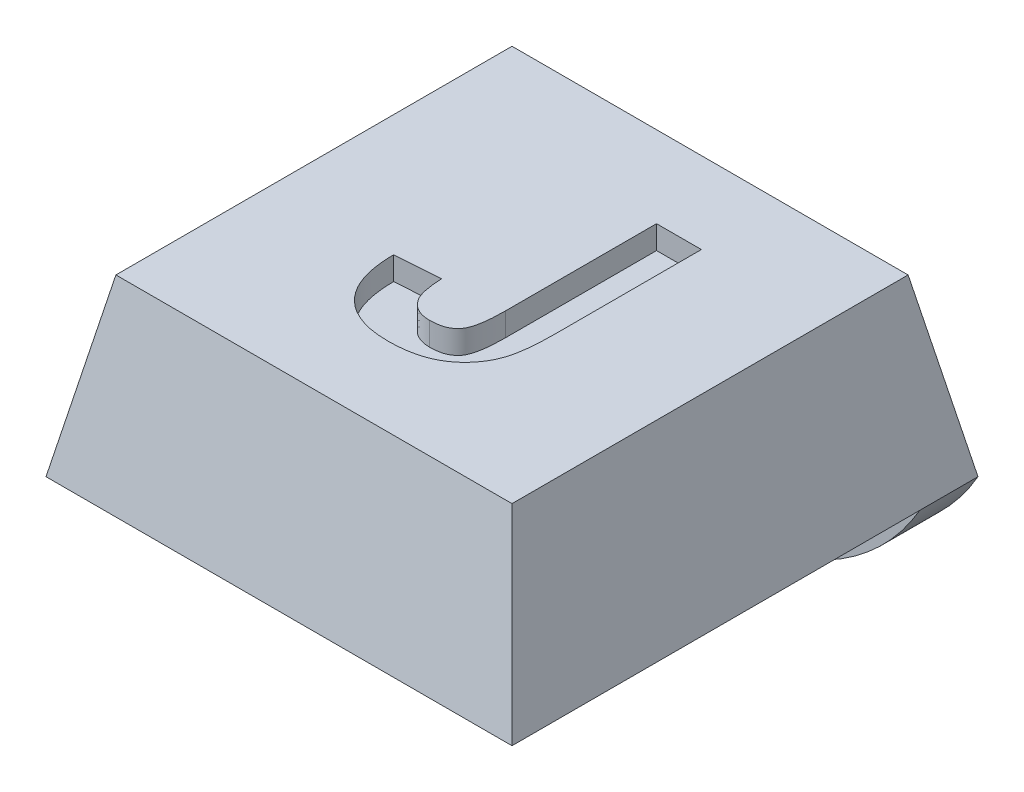
ISO-10303-21;
HEADER;
FILE_DESCRIPTION(('STEP AP214'),'2;1');
FILE_NAME('part.step','',(''),(''),'','','');
FILE_SCHEMA(('AUTOMOTIVE_DESIGN { 1 0 10303 214 1 1 1 1 }'));
ENDSEC;
DATA;
#1=APPLICATION_CONTEXT('core data for automotive mechanical design processes');
#2=APPLICATION_PROTOCOL_DEFINITION('international standard','automotive_design',2000,#1);
#3=PRODUCT_CONTEXT('',#1,'mechanical');
#4=PRODUCT('Part','Part','',(#3));
#5=PRODUCT_RELATED_PRODUCT_CATEGORY('part','',(#4));
#6=PRODUCT_DEFINITION_FORMATION('','',#4);
#7=PRODUCT_DEFINITION_CONTEXT('part definition',#1,'design');
#8=PRODUCT_DEFINITION('design','',#6,#7);
#9=PRODUCT_DEFINITION_SHAPE('','',#8);
#10=(LENGTH_UNIT() NAMED_UNIT(*) SI_UNIT(.MILLI.,.METRE.));
#11=(NAMED_UNIT(*) PLANE_ANGLE_UNIT() SI_UNIT($,.RADIAN.));
#12=(NAMED_UNIT(*) SI_UNIT($,.STERADIAN.) SOLID_ANGLE_UNIT());
#13=UNCERTAINTY_MEASURE_WITH_UNIT(LENGTH_MEASURE(1.E-05),#10,'distance_accuracy_value','');
#14=(GEOMETRIC_REPRESENTATION_CONTEXT(3) GLOBAL_UNCERTAINTY_ASSIGNED_CONTEXT((#13)) GLOBAL_UNIT_ASSIGNED_CONTEXT((#10,
#11,#12)) REPRESENTATION_CONTEXT('',''));
#15=CARTESIAN_POINT('',(0.,0.,0.));
#16=DIRECTION('',(0.,0.,1.));
#17=DIRECTION('',(1.,0.,0.));
#18=AXIS2_PLACEMENT_3D('',#15,#16,#17);
#19=CARTESIAN_POINT('',(0.,3.,0.));
#20=DIRECTION('',(0.,-1.,0.));
#21=DIRECTION('',(0.,0.,-1.));
#22=AXIS2_PLACEMENT_3D('',#19,#20,#21);
#23=PLANE('',#22);
#24=DIRECTION('',(-1.,0.,0.));
#25=VECTOR('',#24,1.);
#26=CARTESIAN_POINT('',(11.,3.,-0.6));
#27=LINE('',#26,#25);
#28=CARTESIAN_POINT('',(7.4,3.,-0.6));
#29=VERTEX_POINT('',#28);
#30=CARTESIAN_POINT('',(0.6,3.,-0.6));
#31=VERTEX_POINT('',#30);
#32=EDGE_CURVE('E217',#29,#31,#27,.T.);
#33=ORIENTED_EDGE('',*,*,#32,.F.);
#34=DIRECTION('',(0.,0.,1.));
#35=VECTOR('',#34,1.);
#36=CARTESIAN_POINT('',(7.4,3.,-8.));
#37=LINE('',#36,#35);
#38=CARTESIAN_POINT('',(7.4,3.,-7.4));
#39=VERTEX_POINT('',#38);
#40=EDGE_CURVE('E230',#39,#29,#37,.T.);
#41=ORIENTED_EDGE('',*,*,#40,.F.);
#42=DIRECTION('',(-1.,0.,0.));
#43=VECTOR('',#42,1.);
#44=CARTESIAN_POINT('',(11.,3.,-7.4));
#45=LINE('',#44,#43);
#46=CARTESIAN_POINT('',(0.599999999999999,3.,-7.4));
#47=VERTEX_POINT('',#46);
#48=EDGE_CURVE('E213',#39,#47,#45,.T.);
#49=ORIENTED_EDGE('',*,*,#48,.T.);
#50=DIRECTION('',(0.,0.,1.));
#51=VECTOR('',#50,1.);
#52=CARTESIAN_POINT('',(0.6,3.,-8.));
#53=LINE('',#52,#51);
#54=EDGE_CURVE('E233',#47,#31,#53,.T.);
#55=ORIENTED_EDGE('',*,*,#54,.T.);
#56=EDGE_LOOP('',(#33,#41,#49,#55));
#57=FACE_BOUND('',#56,.T.);
#58=DIRECTION('',(0.,0.,-1.));
#59=VECTOR('',#58,1.);
#60=CARTESIAN_POINT('',(4.47863523599211,3.,-3.41391404386237));
#61=LINE('',#60,#59);
#62=CARTESIAN_POINT('',(4.47863523599211,3.,-3.41391404386237));
#63=VERTEX_POINT('',#62);
#64=CARTESIAN_POINT('',(4.47863523599211,3.,-6.00285635155468));
#65=VERTEX_POINT('',#64);
#66=EDGE_CURVE('E58',#63,#65,#61,.T.);
#67=ORIENTED_EDGE('',*,*,#66,.T.);
#68=DIRECTION('',(1.,0.,0.));
#69=VECTOR('',#68,1.);
#70=CARTESIAN_POINT('',(4.47863523599211,3.,-6.00285635155468));
#71=LINE('',#70,#69);
#72=CARTESIAN_POINT('',(5.24786600522288,3.,-6.00285635155468));
#73=VERTEX_POINT('',#72);
#74=EDGE_CURVE('E185',#65,#73,#71,.T.);
#75=ORIENTED_EDGE('',*,*,#74,.T.);
#76=DIRECTION('',(0.,0.,1.));
#77=VECTOR('',#76,1.);
#78=CARTESIAN_POINT('',(5.24786600522288,3.,-6.00285635155468));
#79=LINE('',#78,#77);
#80=CARTESIAN_POINT('',(5.24786600522288,3.,-3.48122173617007));
#81=VERTEX_POINT('',#80);
#82=EDGE_CURVE('E656',#73,#81,#79,.T.);
#83=ORIENTED_EDGE('',*,*,#82,.T.);
#84=CARTESIAN_POINT('',(5.24786600522288,3.,-3.48122173617007));
#85=CARTESIAN_POINT('',(5.24752225511572,3.,-3.44115386886636));
#86=CARTESIAN_POINT('',(5.2468552055461,3.,-3.36340188251499));
#87=CARTESIAN_POINT('',(5.24275650156162,3.,-3.25039046502719));
#88=CARTESIAN_POINT('',(5.23665832133049,3.,-3.14454193046868));
#89=CARTESIAN_POINT('',(5.22727722213507,3.,-3.04587147100803));
#90=CARTESIAN_POINT('',(5.21405872026987,3.,-2.95459238833429));
#91=CARTESIAN_POINT('',(5.20004986677814,3.,-2.86997657489744));
#92=CARTESIAN_POINT('',(5.18304142709716,3.,-2.79245169237198));
#93=CARTESIAN_POINT('',(5.16780003561618,3.,-2.74395130585806));
#94=CARTESIAN_POINT('',(5.16052626163313,3.,-2.7208050695034));
#95=B_SPLINE_CURVE_WITH_KNOTS('',3,(#84,#85,#86,#87,#88,#89,#90,#91,#92,#93,#94),.UNSPECIFIED.,
.F.,.F.,(4,1,1,1,1,1,1,1,4),(0.,0.156452495119165,0.303597198546586,0.441515756123935,
0.57040444623701,0.690463066411908,0.801567510862614,0.905300439354285,1.),.UNSPECIFIED.);
#96=CARTESIAN_POINT('',(5.16052626163313,3.,-2.7208050695034));
#97=VERTEX_POINT('',#96);
#98=EDGE_CURVE('E651',#81,#97,#95,.T.);
#99=ORIENTED_EDGE('',*,*,#98,.T.);
#100=CARTESIAN_POINT('',(5.16052626163313,3.,-2.7208050695034));
#101=CARTESIAN_POINT('',(5.15036108111888,3.,-2.69228260075384));
#102=CARTESIAN_POINT('',(5.13024360189988,3.,-2.63583498808826));
#103=CARTESIAN_POINT('',(5.09114165266873,3.,-2.55531488098573));
#104=CARTESIAN_POINT('',(5.04617643068522,3.,-2.47908431540956));
#105=CARTESIAN_POINT('',(4.9954744836834,3.,-2.40681293841355));
#106=CARTESIAN_POINT('',(4.93951471700895,3.,-2.3382109873061));
#107=CARTESIAN_POINT('',(4.87639907650832,3.,-2.27508664932136));
#108=CARTESIAN_POINT('',(4.80834779956692,3.,-2.21523809822528));
#109=CARTESIAN_POINT('',(4.73344668122952,3.,-2.16114528886516));
#110=CARTESIAN_POINT('',(4.65358079146145,3.,-2.11070979383156));
#111=CARTESIAN_POINT('',(4.56647505050752,3.,-2.06868896260535));
#112=CARTESIAN_POINT('',(4.47384329891444,3.,-2.03234038710198));
#113=CARTESIAN_POINT('',(4.37490810397317,3.,-2.00281662788184));
#114=CARTESIAN_POINT('',(4.26964077765763,3.,-1.97971607285242));
#115=CARTESIAN_POINT('',(4.15831100110899,3.,-1.96290189406509));
#116=CARTESIAN_POINT('',(4.04077046567442,3.,-1.95334773003709));
#117=CARTESIAN_POINT('',(3.96049016407211,3.,-1.95217527382871));
#118=CARTESIAN_POINT('',(3.91934036419724,3.,-1.95157430027263));
#119=B_SPLINE_CURVE_WITH_KNOTS('',3,(#100,#101,#102,#103,#104,#105,#106,#107,#108,#109,#110,
#111,#112,#113,#114,#115,#116,#117,#118),.UNSPECIFIED.,.F.,.F.,(4,1,1,1,1,1,1,1,1,1,1,1,1,1,1,1,
4),(0.,0.0578458170130587,0.114480212135457,0.170784536242213,0.226875480201814,
0.283096404177707,0.339779109412981,0.397319931612097,0.456142184292489,0.516216371074673,
0.577640129433395,0.640691136416188,0.706271339139874,0.77477558408517,0.846550476911842,
0.921345373149547,1.),.UNSPECIFIED.);
#120=CARTESIAN_POINT('',(3.91934036419724,3.,-1.95157430027263));
#121=VERTEX_POINT('',#120);
#122=EDGE_CURVE('E641',#97,#121,#119,.T.);
#123=ORIENTED_EDGE('',*,*,#122,.T.);
#124=CARTESIAN_POINT('',(3.91934036419724,3.,-1.95157430027263));
#125=CARTESIAN_POINT('',(3.87122552775589,3.,-1.95273721135087));
#126=CARTESIAN_POINT('',(3.77768594443229,3.,-1.95499801541353));
#127=CARTESIAN_POINT('',(3.64166147511049,3.,-1.9700076897214));
#128=CARTESIAN_POINT('',(3.51410056447315,3.,-1.99626024238106));
#129=CARTESIAN_POINT('',(3.39538704832291,3.,-2.03417967545256));
#130=CARTESIAN_POINT('',(3.28430787386042,3.,-2.08131717039047));
#131=CARTESIAN_POINT('',(3.18220656089415,3.,-2.14011472571528));
#132=CARTESIAN_POINT('',(3.08854047676782,3.,-2.20939270114689));
#133=CARTESIAN_POINT('',(3.00391871149983,3.,-2.28936343112476));
#134=CARTESIAN_POINT('',(2.92829943263745,3.,-2.37921821520504));
#135=CARTESIAN_POINT('',(2.86302647475674,3.,-2.47974541520825));
#136=CARTESIAN_POINT('',(2.80762711961946,3.,-2.5898937430363));
#137=CARTESIAN_POINT('',(2.76298469212978,3.,-2.71016150555024));
#138=CARTESIAN_POINT('',(2.72773939671791,3.,-2.8399729134613));
#139=CARTESIAN_POINT('',(2.7023174618641,3.,-2.97960128819225));
#140=CARTESIAN_POINT('',(2.68714789434325,3.,-3.12912613406769));
#141=CARTESIAN_POINT('',(2.68491317155468,3.,-3.23198720027981));
#142=CARTESIAN_POINT('',(2.68376344112031,3.,-3.28490763360596));
#143=B_SPLINE_CURVE_WITH_KNOTS('',3,(#124,#125,#126,#127,#128,#129,#130,#131,#132,#133,#134,
#135,#136,#137,#138,#139,#140,#141,#142),.UNSPECIFIED.,.F.,.F.,(4,1,1,1,1,1,1,1,1,1,1,1,1,1,1,1,
4),(0.,0.0696292858637476,0.135365614195809,0.197756356389333,0.257779246829448,
0.315436810851021,0.372058901761518,0.427875728209648,0.483657745283362,0.540176831628515,
0.597427412819986,0.65672025189341,0.718247696480561,0.782762362646519,0.851147772011753,
0.923417822731319,1.),.UNSPECIFIED.);
#144=CARTESIAN_POINT('',(2.68376344112031,3.,-3.28490763360596));
#145=VERTEX_POINT('',#144);
#146=EDGE_CURVE('E650',#121,#145,#143,.T.);
#147=ORIENTED_EDGE('',*,*,#146,.T.);
#148=DIRECTION('',(0.997785157856609,0.,-0.0665190105237744));
#149=VECTOR('',#148,1.);
#150=CARTESIAN_POINT('',(2.68376344112031,3.,-3.28490763360596));
#151=LINE('',#150,#149);
#152=CARTESIAN_POINT('',(3.45299421035108,3.,-3.33618968488802));
#153=VERTEX_POINT('',#152);
#154=EDGE_CURVE('E677',#145,#153,#151,.T.);
#155=ORIENTED_EDGE('',*,*,#154,.T.);
#156=CARTESIAN_POINT('',(3.45299421035108,3.,-3.33618968488802));
#157=CARTESIAN_POINT('',(3.45437576720145,3.,-3.30786259790295));
#158=CARTESIAN_POINT('',(3.45702497993634,3.,-3.25354382009574));
#159=CARTESIAN_POINT('',(3.46438093481815,3.,-3.17524086648235));
#160=CARTESIAN_POINT('',(3.47368268694616,3.,-3.10327127682234));
#161=CARTESIAN_POINT('',(3.48585383717944,3.,-3.03785106374312));
#162=CARTESIAN_POINT('',(3.49896082283715,3.,-2.97842744402968));
#163=CARTESIAN_POINT('',(3.51598700225223,3.,-2.9261698568959));
#164=CARTESIAN_POINT('',(3.53388655569812,3.,-2.87924076853295));
#165=CARTESIAN_POINT('',(3.54960838745535,3.,-2.85178351122112));
#166=CARTESIAN_POINT('',(3.55716087701775,3.,-2.83859353104186));
#167=B_SPLINE_CURVE_WITH_KNOTS('',3,(#156,#157,#158,#159,#160,#161,#162,#163,#164,#165,#166),
.UNSPECIFIED.,.F.,.F.,(4,1,1,1,1,1,1,1,4),(0.,0.165826153270336,0.317980948018504,
0.459795738565099,0.589996550393839,0.707065953418222,0.815243566739462,0.911246281264675,1.),.UNSPECIFIED.);
#168=CARTESIAN_POINT('',(3.55716087701775,3.,-2.83859353104186));
#169=VERTEX_POINT('',#168);
#170=EDGE_CURVE('E684',#153,#169,#167,.T.);
#171=ORIENTED_EDGE('',*,*,#170,.T.);
#172=CARTESIAN_POINT('',(3.55716087701775,3.,-2.83859353104186));
#173=CARTESIAN_POINT('',(3.56872297026109,3.,-2.82114812140039));
#174=CARTESIAN_POINT('',(3.5914786098731,3.,-2.78681338232417));
#175=CARTESIAN_POINT('',(3.63299092938756,3.,-2.74207160503994));
#176=CARTESIAN_POINT('',(3.67755853703033,3.,-2.70295584275881));
#177=CARTESIAN_POINT('',(3.7276195539163,3.,-2.67220300867414));
#178=CARTESIAN_POINT('',(3.78178052727939,3.,-2.64801682943951));
#179=CARTESIAN_POINT('',(3.84044803681409,3.,-2.63044224953724));
#180=CARTESIAN_POINT('',(3.90346033058215,3.,-2.61978585285303));
#181=CARTESIAN_POINT('',(3.94680846284558,3.,-2.61876437011324));
#182=CARTESIAN_POINT('',(3.96901985137672,3.,-2.6182409669393));
#183=B_SPLINE_CURVE_WITH_KNOTS('',3,(#172,#173,#174,#175,#176,#177,#178,#179,#180,#181,#182),
.UNSPECIFIED.,.F.,.F.,(4,1,1,1,1,1,1,1,4),(0.,0.127957288456737,0.251835881320901,
0.372465314870914,0.490006212112382,0.610068863669226,0.734765287953249,0.864094923273421,1.),.UNSPECIFIED.);
#184=CARTESIAN_POINT('',(3.96901985137672,3.,-2.6182409669393));
#185=VERTEX_POINT('',#184);
#186=EDGE_CURVE('E690',#169,#185,#183,.T.);
#187=ORIENTED_EDGE('',*,*,#186,.T.);
#188=CARTESIAN_POINT('',(3.96901985137672,3.,-2.6182409669393));
#189=CARTESIAN_POINT('',(3.99147724775292,3.,-2.61865945316102));
#190=CARTESIAN_POINT('',(4.03464752738319,3.,-2.61946391717416));
#191=CARTESIAN_POINT('',(4.09686091011261,3.,-2.62677921913698));
#192=CARTESIAN_POINT('',(4.15406303340528,3.,-2.63863282439469));
#193=CARTESIAN_POINT('',(4.20628505369981,3.,-2.65529485624049));
#194=CARTESIAN_POINT('',(4.25370386751579,3.,-2.6769246227107));
#195=CARTESIAN_POINT('',(4.29526839276369,3.,-2.7045961658879));
#196=CARTESIAN_POINT('',(4.33276968959403,3.,-2.73573291501313));
#197=CARTESIAN_POINT('',(4.3651648902046,3.,-2.77318826399133));
#198=CARTESIAN_POINT('',(4.3927662355869,3.,-2.81831895728671));
#199=CARTESIAN_POINT('',(4.41581210499667,3.,-2.87324896159926));
#200=CARTESIAN_POINT('',(4.43563784023723,3.,-2.93820422141634));
#201=CARTESIAN_POINT('',(4.45096017752995,3.,-3.01367854972563));
#202=CARTESIAN_POINT('',(4.46400250876483,3.,-3.09894939887271));
#203=CARTESIAN_POINT('',(4.47218369239211,3.,-3.19477071558805));
#204=CARTESIAN_POINT('',(4.4780643862916,3.,-3.30085929507591));
#205=CARTESIAN_POINT('',(4.47843963391815,3.,-3.375175750204));
#206=CARTESIAN_POINT('',(4.47863523599211,3.,-3.41391404386237));
#207=B_SPLINE_CURVE_WITH_KNOTS('',3,(#188,#189,#190,#191,#192,#193,#194,#195,#196,#197,#198,
#199,#200,#201,#202,#203,#204,#205,#206),.UNSPECIFIED.,.F.,.F.,(4,1,1,1,1,1,1,1,1,1,1,1,1,1,1,1,
4),(0.,0.0612696766946458,0.117779863322363,0.170676728222519,0.220468992129151,
0.267103819976365,0.312391821648745,0.356352173127523,0.399759083159082,0.446892572188991,
0.500109905692333,0.561902028042048,0.631955790870925,0.7100982931769,0.797211503732284,
0.894294200316469,1.),.UNSPECIFIED.);
#208=EDGE_CURVE('E181',#185,#63,#207,.T.);
#209=ORIENTED_EDGE('',*,*,#208,.T.);
#210=EDGE_LOOP('',(#67,#75,#83,#99,#123,#147,#155,#171,#187,#209));
#211=FACE_BOUND('',#210,.T.);
#212=ADVANCED_FACE('F42',(#57,#211),#23,.F.);
#213=CARTESIAN_POINT('',(8.,0.,-8.));
#214=DIRECTION('',(-0.98058067569092,-0.196116135138184,0.));
#215=DIRECTION('',(0.196116135138184,-0.98058067569092,0.));
#216=AXIS2_PLACEMENT_3D('',#213,#214,#215);
#217=PLANE('',#216);
#218=DIRECTION('',(-0.192450089729875,0.962250448649376,-0.192450089729875));
#219=VECTOR('',#218,1.);
#220=CARTESIAN_POINT('',(7.7037037037037,1.48148148148148,-0.296296296296296));
#221=LINE('',#220,#219);
#222=CARTESIAN_POINT('',(8.,0.,0.));
#223=VERTEX_POINT('',#222);
#224=EDGE_CURVE('E227',#223,#29,#221,.T.);
#225=ORIENTED_EDGE('',*,*,#224,.F.);
#226=DIRECTION('',(0.,0.,-1.));
#227=VECTOR('',#226,1.);
#228=CARTESIAN_POINT('',(8.,0.,0.));
#229=LINE('',#228,#227);
#230=CARTESIAN_POINT('',(8.,0.,-7.));
#231=VERTEX_POINT('',#230);
#232=EDGE_CURVE('E246',#223,#231,#229,.T.);
#233=ORIENTED_EDGE('',*,*,#232,.T.);
#234=DIRECTION('',(0.,0.,1.));
#235=VECTOR('',#234,1.);
#236=CARTESIAN_POINT('',(8.,0.,-8.));
#237=LINE('',#236,#235);
#238=CARTESIAN_POINT('',(8.,0.,-8.));
#239=VERTEX_POINT('',#238);
#240=EDGE_CURVE('E187',#239,#231,#237,.T.);
#241=ORIENTED_EDGE('',*,*,#240,.F.);
#242=DIRECTION('',(0.192450089729875,-0.962250448649376,-0.192450089729875));
#243=VECTOR('',#242,1.);
#244=CARTESIAN_POINT('',(8.,0.,-8.));
#245=LINE('',#244,#243);
#246=EDGE_CURVE('E220',#39,#239,#245,.T.);
#247=ORIENTED_EDGE('',*,*,#246,.F.);
#248=ORIENTED_EDGE('',*,*,#40,.T.);
#249=EDGE_LOOP('',(#225,#233,#241,#247,#248));
#250=FACE_BOUND('',#249,.T.);
#251=ADVANCED_FACE('F314',(#250),#217,.F.);
#252=CARTESIAN_POINT('',(0.,0.,-8.));
#253=DIRECTION('',(0.98058067569092,-0.196116135138184,0.));
#254=DIRECTION('',(0.196116135138184,0.98058067569092,0.));
#255=AXIS2_PLACEMENT_3D('',#252,#253,#254);
#256=PLANE('',#255);
#257=DIRECTION('',(-0.192450089729875,-0.962250448649376,0.192450089729875));
#258=VECTOR('',#257,1.);
#259=CARTESIAN_POINT('',(0.296296296296296,1.48148148148148,-0.296296296296296));
#260=LINE('',#259,#258);
#261=CARTESIAN_POINT('',(0.,0.,0.));
#262=VERTEX_POINT('',#261);
#263=EDGE_CURVE('E274',#31,#262,#260,.T.);
#264=ORIENTED_EDGE('',*,*,#263,.F.);
#265=ORIENTED_EDGE('',*,*,#54,.F.);
#266=DIRECTION('',(0.192450089729875,0.962250448649376,0.192450089729875));
#267=VECTOR('',#266,1.);
#268=CARTESIAN_POINT('',(0.,0.,-8.));
#269=LINE('',#268,#267);
#270=CARTESIAN_POINT('',(0.,0.,-8.));
#271=VERTEX_POINT('',#270);
#272=EDGE_CURVE('E245',#271,#47,#269,.T.);
#273=ORIENTED_EDGE('',*,*,#272,.F.);
#274=DIRECTION('',(0.,0.,1.));
#275=VECTOR('',#274,1.);
#276=CARTESIAN_POINT('',(0.,0.,0.));
#277=LINE('',#276,#275);
#278=CARTESIAN_POINT('',(0.,0.,-7.));
#279=VERTEX_POINT('',#278);
#280=EDGE_CURVE('E250',#271,#279,#277,.T.);
#281=ORIENTED_EDGE('',*,*,#280,.T.);
#282=EDGE_CURVE('E237',#279,#262,#277,.T.);
#283=ORIENTED_EDGE('',*,*,#282,.T.);
#284=EDGE_LOOP('',(#264,#265,#273,#281,#283));
#285=FACE_BOUND('',#284,.T.);
#286=ADVANCED_FACE('F298',(#285),#256,.F.);
#287=CARTESIAN_POINT('',(0.,0.,0.));
#288=DIRECTION('',(0.,-1.,0.));
#289=DIRECTION('',(0.,0.,-1.));
#290=AXIS2_PLACEMENT_3D('',#287,#288,#289);
#291=PLANE('',#290);
#292=DIRECTION('',(-1.,0.,0.));
#293=VECTOR('',#292,1.);
#294=CARTESIAN_POINT('',(0.,0.,-7.));
#295=LINE('',#294,#293);
#296=EDGE_CURVE('E193',#231,#279,#295,.T.);
#297=ORIENTED_EDGE('',*,*,#296,.F.);
#298=ORIENTED_EDGE('',*,*,#232,.F.);
#299=DIRECTION('',(1.,0.,0.));
#300=VECTOR('',#299,1.);
#301=CARTESIAN_POINT('',(0.,0.,0.));
#302=LINE('',#301,#300);
#303=EDGE_CURVE('E247',#262,#223,#302,.T.);
#304=ORIENTED_EDGE('',*,*,#303,.F.);
#305=ORIENTED_EDGE('',*,*,#282,.F.);
#306=EDGE_LOOP('',(#297,#298,#304,#305));
#307=FACE_BOUND('',#306,.T.);
#308=CARTESIAN_POINT('',(4.,0.,-3.75));
#309=DIRECTION('',(0.,-1.,0.));
#310=DIRECTION('',(0.,0.,-1.));
#311=AXIS2_PLACEMENT_3D('',#308,#309,#310);
#312=CIRCLE('',#311,1.8);
#313=CARTESIAN_POINT('',(4.,0.,-5.55));
#314=VERTEX_POINT('',#313);
#315=EDGE_CURVE('E205',#314,#314,#312,.T.);
#316=ORIENTED_EDGE('',*,*,#315,.F.);
#317=EDGE_LOOP('',(#316));
#318=FACE_BOUND('',#317,.T.);
#319=ADVANCED_FACE('F309',(#307,#318),#291,.T.);
#320=CARTESIAN_POINT('',(11.,3.,-7.4));
#321=DIRECTION('',(0.,0.196116135138184,-0.98058067569092));
#322=DIRECTION('',(0.,0.98058067569092,0.196116135138184));
#323=AXIS2_PLACEMENT_3D('',#320,#321,#322);
#324=PLANE('',#323);
#325=ORIENTED_EDGE('',*,*,#246,.T.);
#326=DIRECTION('',(-1.,0.,0.));
#327=VECTOR('',#326,1.);
#328=CARTESIAN_POINT('',(0.,0.,-8.));
#329=LINE('',#328,#327);
#330=EDGE_CURVE('E241',#239,#271,#329,.T.);
#331=ORIENTED_EDGE('',*,*,#330,.T.);
#332=ORIENTED_EDGE('',*,*,#272,.T.);
#333=ORIENTED_EDGE('',*,*,#48,.F.);
#334=EDGE_LOOP('',(#325,#331,#332,#333));
#335=FACE_BOUND('',#334,.T.);
#336=ADVANCED_FACE('F293',(#335),#324,.T.);
#337=CARTESIAN_POINT('',(11.,0.,0.));
#338=DIRECTION('',(0.,0.196116135138184,0.98058067569092));
#339=DIRECTION('',(0.,-0.98058067569092,0.196116135138184));
#340=AXIS2_PLACEMENT_3D('',#337,#338,#339);
#341=PLANE('',#340);
#342=ORIENTED_EDGE('',*,*,#224,.T.);
#343=ORIENTED_EDGE('',*,*,#32,.T.);
#344=ORIENTED_EDGE('',*,*,#263,.T.);
#345=ORIENTED_EDGE('',*,*,#303,.T.);
#346=EDGE_LOOP('',(#342,#343,#344,#345));
#347=FACE_BOUND('',#346,.T.);
#348=ADVANCED_FACE('F340',(#347),#341,.T.);
#349=CARTESIAN_POINT('',(4.,0.8,-3.75));
#350=DIRECTION('',(0.,-1.,0.));
#351=DIRECTION('',(0.,0.,-1.));
#352=AXIS2_PLACEMENT_3D('',#349,#350,#351);
#353=CYLINDRICAL_SURFACE('',#352,1.8);
#354=CARTESIAN_POINT('',(4.,0.8,-3.75));
#355=DIRECTION('',(0.,-1.,0.));
#356=DIRECTION('',(0.,0.,-1.));
#357=AXIS2_PLACEMENT_3D('',#354,#355,#356);
#358=CIRCLE('',#357,1.8);
#359=CARTESIAN_POINT('',(4.,0.8,-5.55));
#360=VERTEX_POINT('',#359);
#361=EDGE_CURVE('E209',#360,#360,#358,.T.);
#362=ORIENTED_EDGE('',*,*,#361,.F.);
#363=EDGE_LOOP('',(#362));
#364=FACE_BOUND('',#363,.T.);
#365=ORIENTED_EDGE('',*,*,#315,.T.);
#366=EDGE_LOOP('',(#365));
#367=FACE_BOUND('',#366,.T.);
#368=ADVANCED_FACE('F347',(#364,#367),#353,.F.);
#369=CARTESIAN_POINT('',(4.,0.8,-3.75));
#370=DIRECTION('',(0.,-1.,0.));
#371=DIRECTION('',(0.,0.,-1.));
#372=AXIS2_PLACEMENT_3D('',#369,#370,#371);
#373=PLANE('',#372);
#374=ORIENTED_EDGE('',*,*,#361,.T.);
#375=EDGE_LOOP('',(#374));
#376=FACE_BOUND('',#375,.T.);
#377=ADVANCED_FACE('F351',(#376),#373,.T.);
#378=CARTESIAN_POINT('',(0.,-2.,-8.));
#379=DIRECTION('',(0.,0.,1.));
#380=DIRECTION('',(1.,0.,0.));
#381=AXIS2_PLACEMENT_3D('',#378,#379,#380);
#382=PLANE('',#381);
#383=ORIENTED_EDGE('',*,*,#330,.F.);
#384=CARTESIAN_POINT('',(4.53589838486225,2.,-8.));
#385=DIRECTION('',(0.,0.,1.));
#386=DIRECTION('',(1.,0.,0.));
#387=AXIS2_PLACEMENT_3D('',#384,#385,#386);
#388=CIRCLE('',#387,4.);
#389=CARTESIAN_POINT('',(4.53589838486225,-2.,-8.));
#390=VERTEX_POINT('',#389);
#391=EDGE_CURVE('E11',#239,#390,#388,.F.);
#392=ORIENTED_EDGE('',*,*,#391,.T.);
#393=DIRECTION('',(1.,0.,0.));
#394=VECTOR('',#393,1.);
#395=CARTESIAN_POINT('',(0.,-2.,-8.));
#396=LINE('',#395,#394);
#397=CARTESIAN_POINT('',(3.46410161513775,-2.,-8.));
#398=VERTEX_POINT('',#397);
#399=EDGE_CURVE('E199',#398,#390,#396,.T.);
#400=ORIENTED_EDGE('',*,*,#399,.F.);
#401=CARTESIAN_POINT('',(3.46410161513775,2.,-8.));
#402=DIRECTION('',(0.,0.,1.));
#403=DIRECTION('',(1.,0.,0.));
#404=AXIS2_PLACEMENT_3D('',#401,#402,#403);
#405=CIRCLE('',#404,4.);
#406=EDGE_CURVE('E51',#398,#271,#405,.F.);
#407=ORIENTED_EDGE('',*,*,#406,.T.);
#408=EDGE_LOOP('',(#383,#392,#400,#407));
#409=FACE_BOUND('',#408,.T.);
#410=ADVANCED_FACE('F286',(#409),#382,.F.);
#411=CARTESIAN_POINT('',(0.,-2.,-7.));
#412=DIRECTION('',(0.,0.,-1.));
#413=DIRECTION('',(-1.,0.,0.));
#414=AXIS2_PLACEMENT_3D('',#411,#412,#413);
#415=PLANE('',#414);
#416=DIRECTION('',(-1.,0.,0.));
#417=VECTOR('',#416,1.);
#418=CARTESIAN_POINT('',(0.,-2.,-7.));
#419=LINE('',#418,#417);
#420=CARTESIAN_POINT('',(4.53589838486225,-2.,-7.));
#421=VERTEX_POINT('',#420);
#422=CARTESIAN_POINT('',(3.46410161513775,-2.,-7.));
#423=VERTEX_POINT('',#422);
#424=EDGE_CURVE('E203',#421,#423,#419,.T.);
#425=ORIENTED_EDGE('',*,*,#424,.F.);
#426=CARTESIAN_POINT('',(4.53589838486225,2.,-7.));
#427=DIRECTION('',(0.,0.,-1.));
#428=DIRECTION('',(-1.,0.,0.));
#429=AXIS2_PLACEMENT_3D('',#426,#427,#428);
#430=CIRCLE('',#429,4.);
#431=EDGE_CURVE('E280',#421,#231,#430,.F.);
#432=ORIENTED_EDGE('',*,*,#431,.T.);
#433=ORIENTED_EDGE('',*,*,#296,.T.);
#434=CARTESIAN_POINT('',(3.46410161513775,2.,-7.));
#435=DIRECTION('',(0.,0.,-1.));
#436=DIRECTION('',(-1.,0.,0.));
#437=AXIS2_PLACEMENT_3D('',#434,#435,#436);
#438=CIRCLE('',#437,4.);
#439=EDGE_CURVE('E66',#279,#423,#438,.F.);
#440=ORIENTED_EDGE('',*,*,#439,.T.);
#441=EDGE_LOOP('',(#425,#432,#433,#440));
#442=FACE_BOUND('',#441,.T.);
#443=ADVANCED_FACE('F304',(#442),#415,.F.);
#444=CARTESIAN_POINT('',(0.,-2.,0.));
#445=DIRECTION('',(0.,1.,0.));
#446=DIRECTION('',(0.,0.,1.));
#447=AXIS2_PLACEMENT_3D('',#444,#445,#446);
#448=PLANE('',#447);
#449=ORIENTED_EDGE('',*,*,#399,.T.);
#450=DIRECTION('',(0.,0.,1.));
#451=VECTOR('',#450,1.);
#452=CARTESIAN_POINT('',(4.53589838486225,-2.,0.));
#453=LINE('',#452,#451);
#454=EDGE_CURVE('E273',#390,#421,#453,.T.);
#455=ORIENTED_EDGE('',*,*,#454,.T.);
#456=ORIENTED_EDGE('',*,*,#424,.T.);
#457=DIRECTION('',(0.,0.,-1.));
#458=VECTOR('',#457,1.);
#459=CARTESIAN_POINT('',(3.46410161513775,-2.,0.));
#460=LINE('',#459,#458);
#461=EDGE_CURVE('E269',#423,#398,#460,.T.);
#462=ORIENTED_EDGE('',*,*,#461,.T.);
#463=EDGE_LOOP('',(#449,#455,#456,#462));
#464=FACE_BOUND('',#463,.T.);
#465=ADVANCED_FACE('F302',(#464),#448,.F.);
#466=CARTESIAN_POINT('',(4.53589838486225,2.,-8.));
#467=DIRECTION('',(0.,0.,1.));
#468=DIRECTION('',(1.,0.,0.));
#469=AXIS2_PLACEMENT_3D('',#466,#467,#468);
#470=CYLINDRICAL_SURFACE('',#469,4.);
#471=ORIENTED_EDGE('',*,*,#391,.F.);
#472=ORIENTED_EDGE('',*,*,#240,.T.);
#473=ORIENTED_EDGE('',*,*,#431,.F.);
#474=ORIENTED_EDGE('',*,*,#454,.F.);
#475=EDGE_LOOP('',(#471,#472,#473,#474));
#476=FACE_BOUND('',#475,.T.);
#477=ADVANCED_FACE('F315',(#476),#470,.T.);
#478=CARTESIAN_POINT('',(3.46410161513775,2.,-8.));
#479=DIRECTION('',(0.,0.,-1.));
#480=DIRECTION('',(-1.,0.,0.));
#481=AXIS2_PLACEMENT_3D('',#478,#479,#480);
#482=CYLINDRICAL_SURFACE('',#481,4.);
#483=ORIENTED_EDGE('',*,*,#439,.F.);
#484=ORIENTED_EDGE('',*,*,#280,.F.);
#485=ORIENTED_EDGE('',*,*,#406,.F.);
#486=ORIENTED_EDGE('',*,*,#461,.F.);
#487=EDGE_LOOP('',(#483,#484,#485,#486));
#488=FACE_BOUND('',#487,.T.);
#489=ADVANCED_FACE('F44',(#488),#482,.T.);
#490=CARTESIAN_POINT('',(4.47863523599211,2.6,-3.41391404386237));
#491=DIRECTION('',(1.,0.,0.));
#492=DIRECTION('',(0.,0.,-1.));
#493=AXIS2_PLACEMENT_3D('',#490,#491,#492);
#494=PLANE('',#493);
#495=ORIENTED_EDGE('',*,*,#66,.F.);
#496=DIRECTION('',(0.,1.,0.));
#497=VECTOR('',#496,1.);
#498=CARTESIAN_POINT('',(4.47863523599211,2.6,-3.41391404386237));
#499=LINE('',#498,#497);
#500=CARTESIAN_POINT('',(4.47863523599211,2.6,-3.41391404386237));
#501=VERTEX_POINT('',#500);
#502=EDGE_CURVE('E179',#501,#63,#499,.T.);
#503=ORIENTED_EDGE('',*,*,#502,.F.);
#504=DIRECTION('',(0.,0.,-1.));
#505=VECTOR('',#504,1.);
#506=CARTESIAN_POINT('',(4.47863523599211,2.6,-3.41391404386237));
#507=LINE('',#506,#505);
#508=CARTESIAN_POINT('',(4.47863523599211,2.6,-6.00285635155468));
#509=VERTEX_POINT('',#508);
#510=EDGE_CURVE('E169',#501,#509,#507,.T.);
#511=ORIENTED_EDGE('',*,*,#510,.T.);
#512=DIRECTION('',(0.,1.,0.));
#513=VECTOR('',#512,1.);
#514=CARTESIAN_POINT('',(4.47863523599211,2.6,-6.00285635155468));
#515=LINE('',#514,#513);
#516=EDGE_CURVE('E178',#509,#65,#515,.T.);
#517=ORIENTED_EDGE('',*,*,#516,.T.);
#518=EDGE_LOOP('',(#495,#503,#511,#517));
#519=FACE_BOUND('',#518,.T.);
#520=ADVANCED_FACE('F177',(#519),#494,.T.);
#521=CARTESIAN_POINT('',(4.47863523599211,2.6,-6.00285635155468));
#522=DIRECTION('',(0.,0.,1.));
#523=DIRECTION('',(1.,0.,0.));
#524=AXIS2_PLACEMENT_3D('',#521,#522,#523);
#525=PLANE('',#524);
#526=ORIENTED_EDGE('',*,*,#74,.F.);
#527=ORIENTED_EDGE('',*,*,#516,.F.);
#528=DIRECTION('',(1.,0.,0.));
#529=VECTOR('',#528,1.);
#530=CARTESIAN_POINT('',(4.47863523599211,2.6,-6.00285635155468));
#531=LINE('',#530,#529);
#532=CARTESIAN_POINT('',(5.24786600522288,2.6,-6.00285635155468));
#533=VERTEX_POINT('',#532);
#534=EDGE_CURVE('E165',#509,#533,#531,.T.);
#535=ORIENTED_EDGE('',*,*,#534,.T.);
#536=DIRECTION('',(0.,1.,0.));
#537=VECTOR('',#536,1.);
#538=CARTESIAN_POINT('',(5.24786600522288,2.6,-6.00285635155468));
#539=LINE('',#538,#537);
#540=EDGE_CURVE('E188',#533,#73,#539,.T.);
#541=ORIENTED_EDGE('',*,*,#540,.T.);
#542=EDGE_LOOP('',(#526,#527,#535,#541));
#543=FACE_BOUND('',#542,.T.);
#544=ADVANCED_FACE('F183',(#543),#525,.T.);
#545=CARTESIAN_POINT('',(5.24786600522288,2.6,-6.00285635155468));
#546=DIRECTION('',(-1.,0.,0.));
#547=DIRECTION('',(0.,0.,1.));
#548=AXIS2_PLACEMENT_3D('',#545,#546,#547);
#549=PLANE('',#548);
#550=ORIENTED_EDGE('',*,*,#82,.F.);
#551=ORIENTED_EDGE('',*,*,#540,.F.);
#552=DIRECTION('',(0.,0.,1.));
#553=VECTOR('',#552,1.);
#554=CARTESIAN_POINT('',(5.24786600522288,2.6,-6.00285635155468));
#555=LINE('',#554,#553);
#556=CARTESIAN_POINT('',(5.24786600522288,2.6,-3.48122173617007));
#557=VERTEX_POINT('',#556);
#558=EDGE_CURVE('E171',#533,#557,#555,.T.);
#559=ORIENTED_EDGE('',*,*,#558,.T.);
#560=DIRECTION('',(0.,1.,0.));
#561=VECTOR('',#560,1.);
#562=CARTESIAN_POINT('',(5.24786600522288,2.6,-3.48122173617007));
#563=LINE('',#562,#561);
#564=EDGE_CURVE('E195',#557,#81,#563,.T.);
#565=ORIENTED_EDGE('',*,*,#564,.T.);
#566=EDGE_LOOP('',(#550,#551,#559,#565));
#567=FACE_BOUND('',#566,.T.);
#568=ADVANCED_FACE('F364',(#567),#549,.T.);
#569=CARTESIAN_POINT('',(5.24786600522288,2.6,-3.48122173617007));
#570=CARTESIAN_POINT('',(5.24752225511572,2.6,-3.44115386886636));
#571=CARTESIAN_POINT('',(5.2468552055461,2.6,-3.36340188251499));
#572=CARTESIAN_POINT('',(5.24275650156162,2.6,-3.25039046502719));
#573=CARTESIAN_POINT('',(5.23665832133049,2.6,-3.14454193046868));
#574=CARTESIAN_POINT('',(5.22727722213507,2.6,-3.04587147100803));
#575=CARTESIAN_POINT('',(5.21405872026987,2.6,-2.95459238833429));
#576=CARTESIAN_POINT('',(5.20004986677814,2.6,-2.86997657489744));
#577=CARTESIAN_POINT('',(5.18304142709716,2.6,-2.79245169237198));
#578=CARTESIAN_POINT('',(5.16780003561618,2.6,-2.74395130585806));
#579=CARTESIAN_POINT('',(5.16052626163313,2.6,-2.7208050695034));
#580=B_SPLINE_CURVE_WITH_KNOTS('',3,(#569,#570,#571,#572,#573,#574,#575,#576,#577,#578,#579),
.UNSPECIFIED.,.F.,.F.,(4,1,1,1,1,1,1,1,4),(0.,0.156452495119165,0.303597198546586,
0.441515756123935,0.57040444623701,0.690463066411908,0.801567510862614,0.905300439354285,1.),.UNSPECIFIED.);
#581=DIRECTION('',(0.,1.,0.));
#582=VECTOR('',#581,1.);
#583=SURFACE_OF_LINEAR_EXTRUSION('',#580,#582);
#584=ORIENTED_EDGE('',*,*,#98,.F.);
#585=ORIENTED_EDGE('',*,*,#564,.F.);
#586=CARTESIAN_POINT('',(5.16052626163313,2.6,-2.7208050695034));
#587=VERTEX_POINT('',#586);
#588=EDGE_CURVE('E376',#557,#587,#580,.T.);
#589=ORIENTED_EDGE('',*,*,#588,.T.);
#590=DIRECTION('',(0.,1.,0.));
#591=VECTOR('',#590,1.);
#592=CARTESIAN_POINT('',(5.16052626163313,2.6,-2.7208050695034));
#593=LINE('',#592,#591);
#594=EDGE_CURVE('E643',#587,#97,#593,.T.);
#595=ORIENTED_EDGE('',*,*,#594,.T.);
#596=EDGE_LOOP('',(#584,#585,#589,#595));
#597=FACE_BOUND('',#596,.T.);
#598=ADVANCED_FACE('F367',(#597),#583,.T.);
#599=CARTESIAN_POINT('',(5.16052626163313,2.6,-2.7208050695034));
#600=CARTESIAN_POINT('',(5.15036108111888,2.6,-2.69228260075384));
#601=CARTESIAN_POINT('',(5.13024360189988,2.6,-2.63583498808826));
#602=CARTESIAN_POINT('',(5.09114165266873,2.6,-2.55531488098573));
#603=CARTESIAN_POINT('',(5.04617643068522,2.6,-2.47908431540956));
#604=CARTESIAN_POINT('',(4.9954744836834,2.6,-2.40681293841355));
#605=CARTESIAN_POINT('',(4.93951471700895,2.6,-2.3382109873061));
#606=CARTESIAN_POINT('',(4.87639907650832,2.6,-2.27508664932136));
#607=CARTESIAN_POINT('',(4.80834779956692,2.6,-2.21523809822528));
#608=CARTESIAN_POINT('',(4.73344668122952,2.6,-2.16114528886516));
#609=CARTESIAN_POINT('',(4.65358079146145,2.6,-2.11070979383156));
#610=CARTESIAN_POINT('',(4.56647505050752,2.6,-2.06868896260535));
#611=CARTESIAN_POINT('',(4.47384329891444,2.6,-2.03234038710198));
#612=CARTESIAN_POINT('',(4.37490810397317,2.6,-2.00281662788184));
#613=CARTESIAN_POINT('',(4.26964077765763,2.6,-1.97971607285242));
#614=CARTESIAN_POINT('',(4.15831100110899,2.6,-1.96290189406509));
#615=CARTESIAN_POINT('',(4.04077046567442,2.6,-1.95334773003709));
#616=CARTESIAN_POINT('',(3.96049016407211,2.6,-1.95217527382871));
#617=CARTESIAN_POINT('',(3.91934036419724,2.6,-1.95157430027263));
#618=B_SPLINE_CURVE_WITH_KNOTS('',3,(#599,#600,#601,#602,#603,#604,#605,#606,#607,#608,#609,
#610,#611,#612,#613,#614,#615,#616,#617),.UNSPECIFIED.,.F.,.F.,(4,1,1,1,1,1,1,1,1,1,1,1,1,1,1,1,
4),(0.,0.0578458170130587,0.114480212135457,0.170784536242213,0.226875480201814,
0.283096404177707,0.339779109412981,0.397319931612097,0.456142184292489,0.516216371074673,
0.577640129433395,0.640691136416188,0.706271339139874,0.77477558408517,0.846550476911842,
0.921345373149547,1.),.UNSPECIFIED.);
#619=DIRECTION('',(0.,1.,0.));
#620=VECTOR('',#619,1.);
#621=SURFACE_OF_LINEAR_EXTRUSION('',#618,#620);
#622=ORIENTED_EDGE('',*,*,#122,.F.);
#623=ORIENTED_EDGE('',*,*,#594,.F.);
#624=CARTESIAN_POINT('',(3.91934036419724,2.6,-1.95157430027263));
#625=VERTEX_POINT('',#624);
#626=EDGE_CURVE('E382',#587,#625,#618,.T.);
#627=ORIENTED_EDGE('',*,*,#626,.T.);
#628=DIRECTION('',(0.,1.,0.));
#629=VECTOR('',#628,1.);
#630=CARTESIAN_POINT('',(3.91934036419724,2.6,-1.95157430027263));
#631=LINE('',#630,#629);
#632=EDGE_CURVE('E646',#625,#121,#631,.T.);
#633=ORIENTED_EDGE('',*,*,#632,.T.);
#634=EDGE_LOOP('',(#622,#623,#627,#633));
#635=FACE_BOUND('',#634,.T.);
#636=ADVANCED_FACE('F372',(#635),#621,.T.);
#637=CARTESIAN_POINT('',(3.91934036419724,2.6,-1.95157430027263));
#638=CARTESIAN_POINT('',(3.87122552775589,2.6,-1.95273721135087));
#639=CARTESIAN_POINT('',(3.77768594443229,2.6,-1.95499801541353));
#640=CARTESIAN_POINT('',(3.64166147511049,2.6,-1.9700076897214));
#641=CARTESIAN_POINT('',(3.51410056447315,2.6,-1.99626024238106));
#642=CARTESIAN_POINT('',(3.39538704832291,2.6,-2.03417967545256));
#643=CARTESIAN_POINT('',(3.28430787386042,2.6,-2.08131717039047));
#644=CARTESIAN_POINT('',(3.18220656089415,2.6,-2.14011472571528));
#645=CARTESIAN_POINT('',(3.08854047676782,2.6,-2.20939270114689));
#646=CARTESIAN_POINT('',(3.00391871149983,2.6,-2.28936343112476));
#647=CARTESIAN_POINT('',(2.92829943263745,2.6,-2.37921821520504));
#648=CARTESIAN_POINT('',(2.86302647475674,2.6,-2.47974541520825));
#649=CARTESIAN_POINT('',(2.80762711961946,2.6,-2.5898937430363));
#650=CARTESIAN_POINT('',(2.76298469212978,2.6,-2.71016150555024));
#651=CARTESIAN_POINT('',(2.72773939671791,2.6,-2.8399729134613));
#652=CARTESIAN_POINT('',(2.7023174618641,2.6,-2.97960128819225));
#653=CARTESIAN_POINT('',(2.68714789434325,2.6,-3.12912613406769));
#654=CARTESIAN_POINT('',(2.68491317155468,2.6,-3.23198720027981));
#655=CARTESIAN_POINT('',(2.68376344112031,2.6,-3.28490763360596));
#656=B_SPLINE_CURVE_WITH_KNOTS('',3,(#637,#638,#639,#640,#641,#642,#643,#644,#645,#646,#647,
#648,#649,#650,#651,#652,#653,#654,#655),.UNSPECIFIED.,.F.,.F.,(4,1,1,1,1,1,1,1,1,1,1,1,1,1,1,1,
4),(0.,0.0696292858637476,0.135365614195809,0.197756356389333,0.257779246829448,
0.315436810851021,0.372058901761518,0.427875728209648,0.483657745283362,0.540176831628515,
0.597427412819986,0.65672025189341,0.718247696480561,0.782762362646519,0.851147772011753,
0.923417822731319,1.),.UNSPECIFIED.);
#657=DIRECTION('',(0.,1.,0.));
#658=VECTOR('',#657,1.);
#659=SURFACE_OF_LINEAR_EXTRUSION('',#656,#658);
#660=ORIENTED_EDGE('',*,*,#146,.F.);
#661=ORIENTED_EDGE('',*,*,#632,.F.);
#662=CARTESIAN_POINT('',(2.68376344112031,2.6,-3.28490763360596));
#663=VERTEX_POINT('',#662);
#664=EDGE_CURVE('E391',#625,#663,#656,.T.);
#665=ORIENTED_EDGE('',*,*,#664,.T.);
#666=DIRECTION('',(0.,1.,0.));
#667=VECTOR('',#666,1.);
#668=CARTESIAN_POINT('',(2.68376344112031,2.6,-3.28490763360596));
#669=LINE('',#668,#667);
#670=EDGE_CURVE('E721',#663,#145,#669,.T.);
#671=ORIENTED_EDGE('',*,*,#670,.T.);
#672=EDGE_LOOP('',(#660,#661,#665,#671));
#673=FACE_BOUND('',#672,.T.);
#674=ADVANCED_FACE('F405',(#673),#659,.T.);
#675=CARTESIAN_POINT('',(2.68376344112031,2.6,-3.28490763360596));
#676=DIRECTION('',(0.0665190105237744,0.,0.997785157856609));
#677=DIRECTION('',(0.997785157856609,0.,-0.0665190105237744));
#678=AXIS2_PLACEMENT_3D('',#675,#676,#677);
#679=PLANE('',#678);
#680=ORIENTED_EDGE('',*,*,#154,.F.);
#681=ORIENTED_EDGE('',*,*,#670,.F.);
#682=DIRECTION('',(0.997785157856609,0.,-0.0665190105237744));
#683=VECTOR('',#682,1.);
#684=CARTESIAN_POINT('',(2.68376344112031,2.6,-3.28490763360596));
#685=LINE('',#684,#683);
#686=CARTESIAN_POINT('',(3.45299421035108,2.6,-3.33618968488802));
#687=VERTEX_POINT('',#686);
#688=EDGE_CURVE('E400',#663,#687,#685,.T.);
#689=ORIENTED_EDGE('',*,*,#688,.T.);
#690=DIRECTION('',(0.,1.,0.));
#691=VECTOR('',#690,1.);
#692=CARTESIAN_POINT('',(3.45299421035108,2.6,-3.33618968488802));
#693=LINE('',#692,#691);
#694=EDGE_CURVE('E718',#687,#153,#693,.T.);
#695=ORIENTED_EDGE('',*,*,#694,.T.);
#696=EDGE_LOOP('',(#680,#681,#689,#695));
#697=FACE_BOUND('',#696,.T.);
#698=ADVANCED_FACE('F408',(#697),#679,.T.);
#699=CARTESIAN_POINT('',(3.45299421035108,2.6,-3.33618968488802));
#700=CARTESIAN_POINT('',(3.45437576720145,2.6,-3.30786259790295));
#701=CARTESIAN_POINT('',(3.45702497993634,2.6,-3.25354382009574));
#702=CARTESIAN_POINT('',(3.46438093481815,2.6,-3.17524086648235));
#703=CARTESIAN_POINT('',(3.47368268694616,2.6,-3.10327127682234));
#704=CARTESIAN_POINT('',(3.48585383717944,2.6,-3.03785106374312));
#705=CARTESIAN_POINT('',(3.49896082283715,2.6,-2.97842744402968));
#706=CARTESIAN_POINT('',(3.51598700225223,2.6,-2.9261698568959));
#707=CARTESIAN_POINT('',(3.53388655569812,2.6,-2.87924076853295));
#708=CARTESIAN_POINT('',(3.54960838745535,2.6,-2.85178351122112));
#709=CARTESIAN_POINT('',(3.55716087701775,2.6,-2.83859353104186));
#710=B_SPLINE_CURVE_WITH_KNOTS('',3,(#699,#700,#701,#702,#703,#704,#705,#706,#707,#708,#709),
.UNSPECIFIED.,.F.,.F.,(4,1,1,1,1,1,1,1,4),(0.,0.165826153270336,0.317980948018504,
0.459795738565099,0.589996550393839,0.707065953418222,0.815243566739462,0.911246281264675,1.),.UNSPECIFIED.);
#711=DIRECTION('',(0.,1.,0.));
#712=VECTOR('',#711,1.);
#713=SURFACE_OF_LINEAR_EXTRUSION('',#710,#712);
#714=ORIENTED_EDGE('',*,*,#170,.F.);
#715=ORIENTED_EDGE('',*,*,#694,.F.);
#716=CARTESIAN_POINT('',(3.55716087701775,2.6,-2.83859353104186));
#717=VERTEX_POINT('',#716);
#718=EDGE_CURVE('E420',#687,#717,#710,.T.);
#719=ORIENTED_EDGE('',*,*,#718,.T.);
#720=DIRECTION('',(0.,1.,0.));
#721=VECTOR('',#720,1.);
#722=CARTESIAN_POINT('',(3.55716087701775,2.6,-2.83859353104186));
#723=LINE('',#722,#721);
#724=EDGE_CURVE('E715',#717,#169,#723,.T.);
#725=ORIENTED_EDGE('',*,*,#724,.T.);
#726=EDGE_LOOP('',(#714,#715,#719,#725));
#727=FACE_BOUND('',#726,.T.);
#728=ADVANCED_FACE('F412',(#727),#713,.T.);
#729=CARTESIAN_POINT('',(3.55716087701775,2.6,-2.83859353104186));
#730=CARTESIAN_POINT('',(3.56872297026109,2.6,-2.82114812140039));
#731=CARTESIAN_POINT('',(3.5914786098731,2.6,-2.78681338232417));
#732=CARTESIAN_POINT('',(3.63299092938756,2.6,-2.74207160503994));
#733=CARTESIAN_POINT('',(3.67755853703033,2.6,-2.70295584275881));
#734=CARTESIAN_POINT('',(3.7276195539163,2.6,-2.67220300867414));
#735=CARTESIAN_POINT('',(3.78178052727939,2.6,-2.64801682943951));
#736=CARTESIAN_POINT('',(3.84044803681409,2.6,-2.63044224953724));
#737=CARTESIAN_POINT('',(3.90346033058215,2.6,-2.61978585285303));
#738=CARTESIAN_POINT('',(3.94680846284558,2.6,-2.61876437011324));
#739=CARTESIAN_POINT('',(3.96901985137672,2.6,-2.6182409669393));
#740=B_SPLINE_CURVE_WITH_KNOTS('',3,(#729,#730,#731,#732,#733,#734,#735,#736,#737,#738,#739),
.UNSPECIFIED.,.F.,.F.,(4,1,1,1,1,1,1,1,4),(0.,0.127957288456737,0.251835881320901,
0.372465314870914,0.490006212112382,0.610068863669226,0.734765287953249,0.864094923273421,1.),.UNSPECIFIED.);
#741=DIRECTION('',(0.,1.,0.));
#742=VECTOR('',#741,1.);
#743=SURFACE_OF_LINEAR_EXTRUSION('',#740,#742);
#744=ORIENTED_EDGE('',*,*,#186,.F.);
#745=ORIENTED_EDGE('',*,*,#724,.F.);
#746=CARTESIAN_POINT('',(3.96901985137672,2.6,-2.6182409669393));
#747=VERTEX_POINT('',#746);
#748=EDGE_CURVE('E425',#717,#747,#740,.T.);
#749=ORIENTED_EDGE('',*,*,#748,.T.);
#750=DIRECTION('',(0.,1.,0.));
#751=VECTOR('',#750,1.);
#752=CARTESIAN_POINT('',(3.96901985137672,2.6,-2.6182409669393));
#753=LINE('',#752,#751);
#754=EDGE_CURVE('E712',#747,#185,#753,.T.);
#755=ORIENTED_EDGE('',*,*,#754,.T.);
#756=EDGE_LOOP('',(#744,#745,#749,#755));
#757=FACE_BOUND('',#756,.T.);
#758=ADVANCED_FACE('F416',(#757),#743,.T.);
#759=CARTESIAN_POINT('',(3.96901985137672,2.6,-2.6182409669393));
#760=CARTESIAN_POINT('',(3.99147724775292,2.6,-2.61865945316102));
#761=CARTESIAN_POINT('',(4.03464752738319,2.6,-2.61946391717416));
#762=CARTESIAN_POINT('',(4.09686091011261,2.6,-2.62677921913698));
#763=CARTESIAN_POINT('',(4.15406303340528,2.6,-2.63863282439469));
#764=CARTESIAN_POINT('',(4.20628505369981,2.6,-2.65529485624049));
#765=CARTESIAN_POINT('',(4.25370386751579,2.6,-2.6769246227107));
#766=CARTESIAN_POINT('',(4.29526839276369,2.6,-2.7045961658879));
#767=CARTESIAN_POINT('',(4.33276968959403,2.6,-2.73573291501313));
#768=CARTESIAN_POINT('',(4.3651648902046,2.6,-2.77318826399133));
#769=CARTESIAN_POINT('',(4.3927662355869,2.6,-2.81831895728671));
#770=CARTESIAN_POINT('',(4.41581210499667,2.6,-2.87324896159926));
#771=CARTESIAN_POINT('',(4.43563784023723,2.6,-2.93820422141634));
#772=CARTESIAN_POINT('',(4.45096017752995,2.6,-3.01367854972563));
#773=CARTESIAN_POINT('',(4.46400250876483,2.6,-3.09894939887271));
#774=CARTESIAN_POINT('',(4.47218369239211,2.6,-3.19477071558805));
#775=CARTESIAN_POINT('',(4.4780643862916,2.6,-3.30085929507591));
#776=CARTESIAN_POINT('',(4.47843963391815,2.6,-3.375175750204));
#777=CARTESIAN_POINT('',(4.47863523599211,2.6,-3.41391404386237));
#778=B_SPLINE_CURVE_WITH_KNOTS('',3,(#759,#760,#761,#762,#763,#764,#765,#766,#767,#768,#769,
#770,#771,#772,#773,#774,#775,#776,#777),.UNSPECIFIED.,.F.,.F.,(4,1,1,1,1,1,1,1,1,1,1,1,1,1,1,1,
4),(0.,0.0612696766946458,0.117779863322363,0.170676728222519,0.220468992129151,
0.267103819976365,0.312391821648745,0.356352173127523,0.399759083159082,0.446892572188991,
0.500109905692333,0.561902028042048,0.631955790870925,0.7100982931769,0.797211503732284,
0.894294200316469,1.),.UNSPECIFIED.);
#779=DIRECTION('',(0.,1.,0.));
#780=VECTOR('',#779,1.);
#781=SURFACE_OF_LINEAR_EXTRUSION('',#778,#780);
#782=ORIENTED_EDGE('',*,*,#208,.F.);
#783=ORIENTED_EDGE('',*,*,#754,.F.);
#784=EDGE_CURVE('E434',#747,#501,#778,.T.);
#785=ORIENTED_EDGE('',*,*,#784,.T.);
#786=ORIENTED_EDGE('',*,*,#502,.T.);
#787=EDGE_LOOP('',(#782,#783,#785,#786));
#788=FACE_BOUND('',#787,.T.);
#789=ADVANCED_FACE('F447',(#788),#781,.T.);
#790=CARTESIAN_POINT('',(5.2320105200224,2.6,-3.09750566920284));
#791=DIRECTION('',(-9.37031804676301E-13,1.,0.));
#792=DIRECTION('',(-1.,-9.37031804676301E-13,0.));
#793=AXIS2_PLACEMENT_3D('',#790,#791,#792);
#794=PLANE('',#793);
#795=ORIENTED_EDGE('',*,*,#510,.F.);
#796=ORIENTED_EDGE('',*,*,#784,.F.);
#797=ORIENTED_EDGE('',*,*,#748,.F.);
#798=ORIENTED_EDGE('',*,*,#718,.F.);
#799=ORIENTED_EDGE('',*,*,#688,.F.);
#800=ORIENTED_EDGE('',*,*,#664,.F.);
#801=ORIENTED_EDGE('',*,*,#626,.F.);
#802=ORIENTED_EDGE('',*,*,#588,.F.);
#803=ORIENTED_EDGE('',*,*,#558,.F.);
#804=ORIENTED_EDGE('',*,*,#534,.F.);
#805=EDGE_LOOP('',(#795,#796,#797,#798,#799,#800,#801,#802,#803,#804));
#806=FACE_BOUND('',#805,.T.);
#807=ADVANCED_FACE('F167',(#806),#794,.T.);
#808=CLOSED_SHELL('',(#212,#251,#286,#319,#336,#348,#368,#377,#410,#443,#465,#477,#489,#520,
#544,#568,#598,#636,#674,#698,#728,#758,#789,#807));
#809=MANIFOLD_SOLID_BREP('B2',#808);
#810=ADVANCED_BREP_SHAPE_REPRESENTATION('',(#18,#809),#14);
#811=SHAPE_DEFINITION_REPRESENTATION(#9,#810);
ENDSEC;
END-ISO-10303-21;
